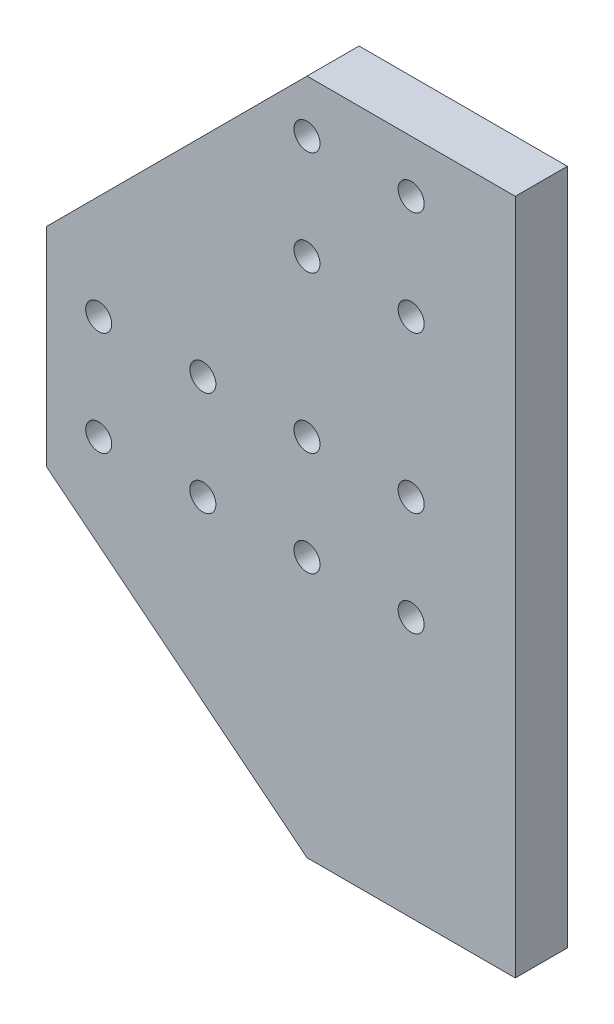
ISO-10303-21;
HEADER;
FILE_DESCRIPTION(('STEP AP214'),'2;1');
FILE_NAME('part.step','',(''),(''),'','','');
FILE_SCHEMA(('AUTOMOTIVE_DESIGN { 1 0 10303 214 1 1 1 1 }'));
ENDSEC;
DATA;
#1=APPLICATION_CONTEXT('core data for automotive mechanical design processes');
#2=APPLICATION_PROTOCOL_DEFINITION('international standard','automotive_design',2000,#1);
#3=PRODUCT_CONTEXT('',#1,'mechanical');
#4=PRODUCT('Part','Part','',(#3));
#5=PRODUCT_RELATED_PRODUCT_CATEGORY('part','',(#4));
#6=PRODUCT_DEFINITION_FORMATION('','',#4);
#7=PRODUCT_DEFINITION_CONTEXT('part definition',#1,'design');
#8=PRODUCT_DEFINITION('design','',#6,#7);
#9=PRODUCT_DEFINITION_SHAPE('','',#8);
#10=(LENGTH_UNIT() NAMED_UNIT(*) SI_UNIT(.MILLI.,.METRE.));
#11=(NAMED_UNIT(*) PLANE_ANGLE_UNIT() SI_UNIT($,.RADIAN.));
#12=(NAMED_UNIT(*) SI_UNIT($,.STERADIAN.) SOLID_ANGLE_UNIT());
#13=UNCERTAINTY_MEASURE_WITH_UNIT(LENGTH_MEASURE(1.E-05),#10,'distance_accuracy_value','');
#14=(GEOMETRIC_REPRESENTATION_CONTEXT(3) GLOBAL_UNCERTAINTY_ASSIGNED_CONTEXT((#13)) GLOBAL_UNIT_ASSIGNED_CONTEXT((#10,
#11,#12)) REPRESENTATION_CONTEXT('',''));
#15=CARTESIAN_POINT('',(0.,0.,0.));
#16=DIRECTION('',(0.,0.,1.));
#17=DIRECTION('',(1.,0.,0.));
#18=AXIS2_PLACEMENT_3D('',#15,#16,#17);
#19=CARTESIAN_POINT('',(-50.,40.,10.));
#20=DIRECTION('',(0.624695047554424,0.78086880944303,0.));
#21=DIRECTION('',(-0.78086880944303,0.624695047554424,0.));
#22=AXIS2_PLACEMENT_3D('',#19,#20,#21);
#23=PLANE('',#22);
#24=DIRECTION('',(0.78086880944303,-0.624695047554424,0.));
#25=VECTOR('',#24,1.);
#26=CARTESIAN_POINT('',(-50.,40.,0.));
#27=LINE('',#26,#25);
#28=CARTESIAN_POINT('',(-50.,40.,0.));
#29=VERTEX_POINT('',#28);
#30=CARTESIAN_POINT('',(0.,0.,0.));
#31=VERTEX_POINT('',#30);
#32=EDGE_CURVE('E123',#29,#31,#27,.T.);
#33=ORIENTED_EDGE('',*,*,#32,.T.);
#34=DIRECTION('',(0.,0.,-1.));
#35=VECTOR('',#34,1.);
#36=CARTESIAN_POINT('',(0.,0.,10.));
#37=LINE('',#36,#35);
#38=CARTESIAN_POINT('',(0.,0.,10.));
#39=VERTEX_POINT('',#38);
#40=EDGE_CURVE('E11',#39,#31,#37,.T.);
#41=ORIENTED_EDGE('',*,*,#40,.F.);
#42=DIRECTION('',(0.78086880944303,-0.624695047554424,0.));
#43=VECTOR('',#42,1.);
#44=CARTESIAN_POINT('',(-50.,40.,10.));
#45=LINE('',#44,#43);
#46=CARTESIAN_POINT('',(-50.,40.,10.));
#47=VERTEX_POINT('',#46);
#48=EDGE_CURVE('E134',#47,#39,#45,.T.);
#49=ORIENTED_EDGE('',*,*,#48,.F.);
#50=DIRECTION('',(0.,0.,-1.));
#51=VECTOR('',#50,1.);
#52=CARTESIAN_POINT('',(-50.,40.,10.));
#53=LINE('',#52,#51);
#54=EDGE_CURVE('E119',#47,#29,#53,.T.);
#55=ORIENTED_EDGE('',*,*,#54,.T.);
#56=EDGE_LOOP('',(#33,#41,#49,#55));
#57=FACE_BOUND('',#56,.T.);
#58=ADVANCED_FACE('F39',(#57),#23,.F.);
#59=CARTESIAN_POINT('',(0.,0.,10.));
#60=DIRECTION('',(0.,1.,0.));
#61=DIRECTION('',(0.,0.,1.));
#62=AXIS2_PLACEMENT_3D('',#59,#60,#61);
#63=PLANE('',#62);
#64=DIRECTION('',(1.,0.,0.));
#65=VECTOR('',#64,1.);
#66=CARTESIAN_POINT('',(0.,0.,0.));
#67=LINE('',#66,#65);
#68=CARTESIAN_POINT('',(40.,0.,0.));
#69=VERTEX_POINT('',#68);
#70=EDGE_CURVE('E126',#31,#69,#67,.T.);
#71=ORIENTED_EDGE('',*,*,#70,.T.);
#72=DIRECTION('',(0.,0.,-1.));
#73=VECTOR('',#72,1.);
#74=CARTESIAN_POINT('',(40.,0.,10.));
#75=LINE('',#74,#73);
#76=CARTESIAN_POINT('',(40.,0.,10.));
#77=VERTEX_POINT('',#76);
#78=EDGE_CURVE('E47',#77,#69,#75,.T.);
#79=ORIENTED_EDGE('',*,*,#78,.F.);
#80=DIRECTION('',(1.,0.,0.));
#81=VECTOR('',#80,1.);
#82=CARTESIAN_POINT('',(0.,0.,10.));
#83=LINE('',#82,#81);
#84=EDGE_CURVE('E92',#39,#77,#83,.T.);
#85=ORIENTED_EDGE('',*,*,#84,.F.);
#86=ORIENTED_EDGE('',*,*,#40,.T.);
#87=EDGE_LOOP('',(#71,#79,#85,#86));
#88=FACE_BOUND('',#87,.T.);
#89=ADVANCED_FACE('F159',(#88),#63,.F.);
#90=CARTESIAN_POINT('',(40.,0.,10.));
#91=DIRECTION('',(-1.,0.,0.));
#92=DIRECTION('',(0.,0.,1.));
#93=AXIS2_PLACEMENT_3D('',#90,#91,#92);
#94=PLANE('',#93);
#95=DIRECTION('',(0.,1.,0.));
#96=VECTOR('',#95,1.);
#97=CARTESIAN_POINT('',(40.,0.,0.));
#98=LINE('',#97,#96);
#99=CARTESIAN_POINT('',(40.,130.,0.));
#100=VERTEX_POINT('',#99);
#101=EDGE_CURVE('E129',#69,#100,#98,.T.);
#102=ORIENTED_EDGE('',*,*,#101,.T.);
#103=DIRECTION('',(0.,0.,-1.));
#104=VECTOR('',#103,1.);
#105=CARTESIAN_POINT('',(40.,130.,10.));
#106=LINE('',#105,#104);
#107=CARTESIAN_POINT('',(40.,130.,10.));
#108=VERTEX_POINT('',#107);
#109=EDGE_CURVE('E114',#108,#100,#106,.T.);
#110=ORIENTED_EDGE('',*,*,#109,.F.);
#111=DIRECTION('',(0.,1.,0.));
#112=VECTOR('',#111,1.);
#113=CARTESIAN_POINT('',(40.,0.,10.));
#114=LINE('',#113,#112);
#115=EDGE_CURVE('E105',#77,#108,#114,.T.);
#116=ORIENTED_EDGE('',*,*,#115,.F.);
#117=ORIENTED_EDGE('',*,*,#78,.T.);
#118=EDGE_LOOP('',(#102,#110,#116,#117));
#119=FACE_BOUND('',#118,.T.);
#120=ADVANCED_FACE('F140',(#119),#94,.F.);
#121=CARTESIAN_POINT('',(40.,130.,10.));
#122=DIRECTION('',(0.,-1.,0.));
#123=DIRECTION('',(0.,0.,-1.));
#124=AXIS2_PLACEMENT_3D('',#121,#122,#123);
#125=PLANE('',#124);
#126=DIRECTION('',(-1.,0.,0.));
#127=VECTOR('',#126,1.);
#128=CARTESIAN_POINT('',(40.,130.,0.));
#129=LINE('',#128,#127);
#130=CARTESIAN_POINT('',(0.,130.,0.));
#131=VERTEX_POINT('',#130);
#132=EDGE_CURVE('E113',#100,#131,#129,.T.);
#133=ORIENTED_EDGE('',*,*,#132,.T.);
#134=DIRECTION('',(0.,0.,-1.));
#135=VECTOR('',#134,1.);
#136=CARTESIAN_POINT('',(0.,130.,10.));
#137=LINE('',#136,#135);
#138=CARTESIAN_POINT('',(0.,130.,10.));
#139=VERTEX_POINT('',#138);
#140=EDGE_CURVE('E110',#139,#131,#137,.T.);
#141=ORIENTED_EDGE('',*,*,#140,.F.);
#142=DIRECTION('',(-1.,0.,0.));
#143=VECTOR('',#142,1.);
#144=CARTESIAN_POINT('',(40.,130.,10.));
#145=LINE('',#144,#143);
#146=EDGE_CURVE('E99',#108,#139,#145,.T.);
#147=ORIENTED_EDGE('',*,*,#146,.F.);
#148=ORIENTED_EDGE('',*,*,#109,.T.);
#149=EDGE_LOOP('',(#133,#141,#147,#148));
#150=FACE_BOUND('',#149,.T.);
#151=ADVANCED_FACE('F111',(#150),#125,.F.);
#152=CARTESIAN_POINT('',(0.,130.,10.));
#153=DIRECTION('',(0.707106781186548,-0.707106781186547,0.));
#154=DIRECTION('',(0.707106781186547,0.707106781186548,0.));
#155=AXIS2_PLACEMENT_3D('',#152,#153,#154);
#156=PLANE('',#155);
#157=DIRECTION('',(-0.707106781186547,-0.707106781186548,0.));
#158=VECTOR('',#157,1.);
#159=CARTESIAN_POINT('',(0.,130.,0.));
#160=LINE('',#159,#158);
#161=CARTESIAN_POINT('',(-50.,80.,0.));
#162=VERTEX_POINT('',#161);
#163=EDGE_CURVE('E78',#131,#162,#160,.T.);
#164=ORIENTED_EDGE('',*,*,#163,.T.);
#165=DIRECTION('',(0.,0.,-1.));
#166=VECTOR('',#165,1.);
#167=CARTESIAN_POINT('',(-50.,80.,10.));
#168=LINE('',#167,#166);
#169=CARTESIAN_POINT('',(-50.,80.,10.));
#170=VERTEX_POINT('',#169);
#171=EDGE_CURVE('E115',#170,#162,#168,.T.);
#172=ORIENTED_EDGE('',*,*,#171,.F.);
#173=DIRECTION('',(-0.707106781186547,-0.707106781186548,0.));
#174=VECTOR('',#173,1.);
#175=CARTESIAN_POINT('',(0.,130.,10.));
#176=LINE('',#175,#174);
#177=EDGE_CURVE('E103',#139,#170,#176,.T.);
#178=ORIENTED_EDGE('',*,*,#177,.F.);
#179=ORIENTED_EDGE('',*,*,#140,.T.);
#180=EDGE_LOOP('',(#164,#172,#178,#179));
#181=FACE_BOUND('',#180,.T.);
#182=ADVANCED_FACE('F117',(#181),#156,.F.);
#183=CARTESIAN_POINT('',(-50.,80.,10.));
#184=DIRECTION('',(1.,0.,0.));
#185=DIRECTION('',(0.,1.,0.));
#186=AXIS2_PLACEMENT_3D('',#183,#184,#185);
#187=PLANE('',#186);
#188=DIRECTION('',(0.,-1.,0.));
#189=VECTOR('',#188,1.);
#190=CARTESIAN_POINT('',(-50.,80.,0.));
#191=LINE('',#190,#189);
#192=EDGE_CURVE('E84',#162,#29,#191,.T.);
#193=ORIENTED_EDGE('',*,*,#192,.T.);
#194=ORIENTED_EDGE('',*,*,#54,.F.);
#195=DIRECTION('',(0.,-1.,0.));
#196=VECTOR('',#195,1.);
#197=CARTESIAN_POINT('',(-50.,80.,10.));
#198=LINE('',#197,#196);
#199=EDGE_CURVE('E55',#170,#47,#198,.T.);
#200=ORIENTED_EDGE('',*,*,#199,.F.);
#201=ORIENTED_EDGE('',*,*,#171,.T.);
#202=EDGE_LOOP('',(#193,#194,#200,#201));
#203=FACE_BOUND('',#202,.T.);
#204=ADVANCED_FACE('F147',(#203),#187,.F.);
#205=CARTESIAN_POINT('',(0.,0.,10.));
#206=DIRECTION('',(0.,0.,-1.));
#207=DIRECTION('',(-1.,0.,0.));
#208=AXIS2_PLACEMENT_3D('',#205,#206,#207);
#209=PLANE('',#208);
#210=CARTESIAN_POINT('',(-20.,70.,10.));
#211=DIRECTION('',(0.,0.,1.));
#212=DIRECTION('',(1.,0.,0.));
#213=AXIS2_PLACEMENT_3D('',#210,#211,#212);
#214=CIRCLE('',#213,2.5);
#215=CARTESIAN_POINT('',(-17.5,70.,10.));
#216=VERTEX_POINT('',#215);
#217=EDGE_CURVE('E379',#216,#216,#214,.T.);
#218=ORIENTED_EDGE('',*,*,#217,.F.);
#219=EDGE_LOOP('',(#218));
#220=FACE_BOUND('',#219,.T.);
#221=CARTESIAN_POINT('',(-40.,50.,10.));
#222=DIRECTION('',(0.,0.,1.));
#223=DIRECTION('',(1.,0.,0.));
#224=AXIS2_PLACEMENT_3D('',#221,#222,#223);
#225=CIRCLE('',#224,2.5);
#226=CARTESIAN_POINT('',(-37.5,50.,10.));
#227=VERTEX_POINT('',#226);
#228=EDGE_CURVE('E385',#227,#227,#225,.T.);
#229=ORIENTED_EDGE('',*,*,#228,.F.);
#230=EDGE_LOOP('',(#229));
#231=FACE_BOUND('',#230,.T.);
#232=CARTESIAN_POINT('',(-20.,50.,10.));
#233=DIRECTION('',(0.,0.,1.));
#234=DIRECTION('',(1.,0.,0.));
#235=AXIS2_PLACEMENT_3D('',#232,#233,#234);
#236=CIRCLE('',#235,2.5);
#237=CARTESIAN_POINT('',(-17.5,50.,10.));
#238=VERTEX_POINT('',#237);
#239=EDGE_CURVE('E396',#238,#238,#236,.T.);
#240=ORIENTED_EDGE('',*,*,#239,.F.);
#241=EDGE_LOOP('',(#240));
#242=FACE_BOUND('',#241,.T.);
#243=CARTESIAN_POINT('',(0.,70.,10.));
#244=DIRECTION('',(0.,0.,1.));
#245=DIRECTION('',(1.,0.,0.));
#246=AXIS2_PLACEMENT_3D('',#243,#244,#245);
#247=CIRCLE('',#246,2.5);
#248=CARTESIAN_POINT('',(2.5,70.,10.));
#249=VERTEX_POINT('',#248);
#250=EDGE_CURVE('E454',#249,#249,#247,.T.);
#251=ORIENTED_EDGE('',*,*,#250,.F.);
#252=EDGE_LOOP('',(#251));
#253=FACE_BOUND('',#252,.T.);
#254=CARTESIAN_POINT('',(20.,120.,10.));
#255=DIRECTION('',(0.,0.,1.));
#256=DIRECTION('',(1.,0.,0.));
#257=AXIS2_PLACEMENT_3D('',#254,#255,#256);
#258=CIRCLE('',#257,2.5);
#259=CARTESIAN_POINT('',(22.5,120.,10.));
#260=VERTEX_POINT('',#259);
#261=EDGE_CURVE('E406',#260,#260,#258,.T.);
#262=ORIENTED_EDGE('',*,*,#261,.F.);
#263=EDGE_LOOP('',(#262));
#264=FACE_BOUND('',#263,.T.);
#265=CARTESIAN_POINT('',(0.,100.,10.));
#266=DIRECTION('',(0.,0.,1.));
#267=DIRECTION('',(1.,0.,0.));
#268=AXIS2_PLACEMENT_3D('',#265,#266,#267);
#269=CIRCLE('',#268,2.5);
#270=CARTESIAN_POINT('',(2.5,100.,10.));
#271=VERTEX_POINT('',#270);
#272=EDGE_CURVE('E413',#271,#271,#269,.T.);
#273=ORIENTED_EDGE('',*,*,#272,.F.);
#274=EDGE_LOOP('',(#273));
#275=FACE_BOUND('',#274,.T.);
#276=CARTESIAN_POINT('',(20.,100.,10.));
#277=DIRECTION('',(0.,0.,1.));
#278=DIRECTION('',(1.,0.,0.));
#279=AXIS2_PLACEMENT_3D('',#276,#277,#278);
#280=CIRCLE('',#279,2.5);
#281=CARTESIAN_POINT('',(22.5,100.,10.));
#282=VERTEX_POINT('',#281);
#283=EDGE_CURVE('E397',#282,#282,#280,.T.);
#284=ORIENTED_EDGE('',*,*,#283,.F.);
#285=EDGE_LOOP('',(#284));
#286=FACE_BOUND('',#285,.T.);
#287=CARTESIAN_POINT('',(-40.,70.,10.));
#288=DIRECTION('',(0.,0.,1.));
#289=DIRECTION('',(1.,0.,0.));
#290=AXIS2_PLACEMENT_3D('',#287,#288,#289);
#291=CIRCLE('',#290,2.5);
#292=CARTESIAN_POINT('',(-37.5,70.,10.));
#293=VERTEX_POINT('',#292);
#294=EDGE_CURVE('E383',#293,#293,#291,.T.);
#295=ORIENTED_EDGE('',*,*,#294,.F.);
#296=EDGE_LOOP('',(#295));
#297=FACE_BOUND('',#296,.T.);
#298=CARTESIAN_POINT('',(20.,50.,10.));
#299=DIRECTION('',(0.,0.,1.));
#300=DIRECTION('',(1.,0.,0.));
#301=AXIS2_PLACEMENT_3D('',#298,#299,#300);
#302=CIRCLE('',#301,2.5);
#303=CARTESIAN_POINT('',(22.5,50.,10.));
#304=VERTEX_POINT('',#303);
#305=EDGE_CURVE('E442',#304,#304,#302,.T.);
#306=ORIENTED_EDGE('',*,*,#305,.F.);
#307=EDGE_LOOP('',(#306));
#308=FACE_BOUND('',#307,.T.);
#309=CARTESIAN_POINT('',(0.,50.,10.));
#310=DIRECTION('',(0.,0.,1.));
#311=DIRECTION('',(1.,0.,0.));
#312=AXIS2_PLACEMENT_3D('',#309,#310,#311);
#313=CIRCLE('',#312,2.5);
#314=CARTESIAN_POINT('',(2.5,50.,10.));
#315=VERTEX_POINT('',#314);
#316=EDGE_CURVE('E446',#315,#315,#313,.T.);
#317=ORIENTED_EDGE('',*,*,#316,.F.);
#318=EDGE_LOOP('',(#317));
#319=FACE_BOUND('',#318,.T.);
#320=CARTESIAN_POINT('',(20.,70.,10.));
#321=DIRECTION('',(0.,0.,1.));
#322=DIRECTION('',(1.,0.,0.));
#323=AXIS2_PLACEMENT_3D('',#320,#321,#322);
#324=CIRCLE('',#323,2.5);
#325=CARTESIAN_POINT('',(22.5,70.,10.));
#326=VERTEX_POINT('',#325);
#327=EDGE_CURVE('E449',#326,#326,#324,.T.);
#328=ORIENTED_EDGE('',*,*,#327,.F.);
#329=EDGE_LOOP('',(#328));
#330=FACE_BOUND('',#329,.T.);
#331=CARTESIAN_POINT('',(0.,120.,10.));
#332=DIRECTION('',(0.,0.,1.));
#333=DIRECTION('',(1.,0.,0.));
#334=AXIS2_PLACEMENT_3D('',#331,#332,#333);
#335=CIRCLE('',#334,2.5);
#336=CARTESIAN_POINT('',(2.5,120.,10.));
#337=VERTEX_POINT('',#336);
#338=EDGE_CURVE('E409',#337,#337,#335,.T.);
#339=ORIENTED_EDGE('',*,*,#338,.F.);
#340=EDGE_LOOP('',(#339));
#341=FACE_BOUND('',#340,.T.);
#342=ORIENTED_EDGE('',*,*,#48,.T.);
#343=ORIENTED_EDGE('',*,*,#84,.T.);
#344=ORIENTED_EDGE('',*,*,#115,.T.);
#345=ORIENTED_EDGE('',*,*,#146,.T.);
#346=ORIENTED_EDGE('',*,*,#177,.T.);
#347=ORIENTED_EDGE('',*,*,#199,.T.);
#348=EDGE_LOOP('',(#342,#343,#344,#345,#346,#347));
#349=FACE_BOUND('',#348,.T.);
#350=ADVANCED_FACE('F101',(#220,#231,#242,#253,#264,#275,#286,#297,#308,#319,#330,#341,#349),
#209,.F.);
#351=CARTESIAN_POINT('',(0.,0.,0.));
#352=DIRECTION('',(0.,0.,-1.));
#353=DIRECTION('',(-1.,0.,0.));
#354=AXIS2_PLACEMENT_3D('',#351,#352,#353);
#355=PLANE('',#354);
#356=CARTESIAN_POINT('',(-20.,70.,0.));
#357=DIRECTION('',(0.,0.,1.));
#358=DIRECTION('',(1.,0.,0.));
#359=AXIS2_PLACEMENT_3D('',#356,#357,#358);
#360=CIRCLE('',#359,2.5);
#361=CARTESIAN_POINT('',(-17.5,70.,0.));
#362=VERTEX_POINT('',#361);
#363=EDGE_CURVE('E376',#362,#362,#360,.T.);
#364=ORIENTED_EDGE('',*,*,#363,.T.);
#365=EDGE_LOOP('',(#364));
#366=FACE_BOUND('',#365,.T.);
#367=CARTESIAN_POINT('',(-40.,50.,0.));
#368=DIRECTION('',(0.,0.,1.));
#369=DIRECTION('',(1.,0.,0.));
#370=AXIS2_PLACEMENT_3D('',#367,#368,#369);
#371=CIRCLE('',#370,2.5);
#372=CARTESIAN_POINT('',(-37.5,50.,0.));
#373=VERTEX_POINT('',#372);
#374=EDGE_CURVE('E393',#373,#373,#371,.T.);
#375=ORIENTED_EDGE('',*,*,#374,.T.);
#376=EDGE_LOOP('',(#375));
#377=FACE_BOUND('',#376,.T.);
#378=CARTESIAN_POINT('',(-20.,50.,0.));
#379=DIRECTION('',(0.,0.,1.));
#380=DIRECTION('',(1.,0.,0.));
#381=AXIS2_PLACEMENT_3D('',#378,#379,#380);
#382=CIRCLE('',#381,2.5);
#383=CARTESIAN_POINT('',(-17.5,50.,0.));
#384=VERTEX_POINT('',#383);
#385=EDGE_CURVE('E467',#384,#384,#382,.T.);
#386=ORIENTED_EDGE('',*,*,#385,.T.);
#387=EDGE_LOOP('',(#386));
#388=FACE_BOUND('',#387,.T.);
#389=CARTESIAN_POINT('',(0.,70.,0.));
#390=DIRECTION('',(0.,0.,1.));
#391=DIRECTION('',(1.,0.,0.));
#392=AXIS2_PLACEMENT_3D('',#389,#390,#391);
#393=CIRCLE('',#392,2.5);
#394=CARTESIAN_POINT('',(2.5,70.,0.));
#395=VERTEX_POINT('',#394);
#396=EDGE_CURVE('E388',#395,#395,#393,.T.);
#397=ORIENTED_EDGE('',*,*,#396,.T.);
#398=EDGE_LOOP('',(#397));
#399=FACE_BOUND('',#398,.T.);
#400=CARTESIAN_POINT('',(20.,120.,0.));
#401=DIRECTION('',(0.,0.,1.));
#402=DIRECTION('',(1.,0.,0.));
#403=AXIS2_PLACEMENT_3D('',#400,#401,#402);
#404=CIRCLE('',#403,2.5);
#405=CARTESIAN_POINT('',(22.5,120.,0.));
#406=VERTEX_POINT('',#405);
#407=EDGE_CURVE('E410',#406,#406,#404,.T.);
#408=ORIENTED_EDGE('',*,*,#407,.T.);
#409=EDGE_LOOP('',(#408));
#410=FACE_BOUND('',#409,.T.);
#411=CARTESIAN_POINT('',(0.,100.,0.));
#412=DIRECTION('',(0.,0.,1.));
#413=DIRECTION('',(1.,0.,0.));
#414=AXIS2_PLACEMENT_3D('',#411,#412,#413);
#415=CIRCLE('',#414,2.5);
#416=CARTESIAN_POINT('',(2.5,100.,0.));
#417=VERTEX_POINT('',#416);
#418=EDGE_CURVE('E400',#417,#417,#415,.T.);
#419=ORIENTED_EDGE('',*,*,#418,.T.);
#420=EDGE_LOOP('',(#419));
#421=FACE_BOUND('',#420,.T.);
#422=CARTESIAN_POINT('',(20.,100.,0.));
#423=DIRECTION('',(0.,0.,1.));
#424=DIRECTION('',(1.,0.,0.));
#425=AXIS2_PLACEMENT_3D('',#422,#423,#424);
#426=CIRCLE('',#425,2.5);
#427=CARTESIAN_POINT('',(22.5,100.,0.));
#428=VERTEX_POINT('',#427);
#429=EDGE_CURVE('E401',#428,#428,#426,.T.);
#430=ORIENTED_EDGE('',*,*,#429,.T.);
#431=EDGE_LOOP('',(#430));
#432=FACE_BOUND('',#431,.T.);
#433=CARTESIAN_POINT('',(-40.,70.,0.));
#434=DIRECTION('',(0.,0.,1.));
#435=DIRECTION('',(1.,0.,0.));
#436=AXIS2_PLACEMENT_3D('',#433,#434,#435);
#437=CIRCLE('',#436,2.5);
#438=CARTESIAN_POINT('',(-37.5,70.,0.));
#439=VERTEX_POINT('',#438);
#440=EDGE_CURVE('E380',#439,#439,#437,.T.);
#441=ORIENTED_EDGE('',*,*,#440,.T.);
#442=EDGE_LOOP('',(#441));
#443=FACE_BOUND('',#442,.T.);
#444=CARTESIAN_POINT('',(20.,50.,0.));
#445=DIRECTION('',(0.,0.,1.));
#446=DIRECTION('',(1.,0.,0.));
#447=AXIS2_PLACEMENT_3D('',#444,#445,#446);
#448=CIRCLE('',#447,2.5);
#449=CARTESIAN_POINT('',(22.5,50.,0.));
#450=VERTEX_POINT('',#449);
#451=EDGE_CURVE('E458',#450,#450,#448,.T.);
#452=ORIENTED_EDGE('',*,*,#451,.T.);
#453=EDGE_LOOP('',(#452));
#454=FACE_BOUND('',#453,.T.);
#455=CARTESIAN_POINT('',(0.,50.,0.));
#456=DIRECTION('',(0.,0.,1.));
#457=DIRECTION('',(1.,0.,0.));
#458=AXIS2_PLACEMENT_3D('',#455,#456,#457);
#459=CIRCLE('',#458,2.5);
#460=CARTESIAN_POINT('',(2.5,50.,0.));
#461=VERTEX_POINT('',#460);
#462=EDGE_CURVE('E462',#461,#461,#459,.T.);
#463=ORIENTED_EDGE('',*,*,#462,.T.);
#464=EDGE_LOOP('',(#463));
#465=FACE_BOUND('',#464,.T.);
#466=CARTESIAN_POINT('',(20.,70.,0.));
#467=DIRECTION('',(0.,0.,1.));
#468=DIRECTION('',(1.,0.,0.));
#469=AXIS2_PLACEMENT_3D('',#466,#467,#468);
#470=CIRCLE('',#469,2.5);
#471=CARTESIAN_POINT('',(22.5,70.,0.));
#472=VERTEX_POINT('',#471);
#473=EDGE_CURVE('E451',#472,#472,#470,.T.);
#474=ORIENTED_EDGE('',*,*,#473,.T.);
#475=EDGE_LOOP('',(#474));
#476=FACE_BOUND('',#475,.T.);
#477=CARTESIAN_POINT('',(0.,120.,0.));
#478=DIRECTION('',(0.,0.,1.));
#479=DIRECTION('',(1.,0.,0.));
#480=AXIS2_PLACEMENT_3D('',#477,#478,#479);
#481=CIRCLE('',#480,2.5);
#482=CARTESIAN_POINT('',(2.5,120.,0.));
#483=VERTEX_POINT('',#482);
#484=EDGE_CURVE('E127',#483,#483,#481,.T.);
#485=ORIENTED_EDGE('',*,*,#484,.T.);
#486=EDGE_LOOP('',(#485));
#487=FACE_BOUND('',#486,.T.);
#488=ORIENTED_EDGE('',*,*,#32,.F.);
#489=ORIENTED_EDGE('',*,*,#192,.F.);
#490=ORIENTED_EDGE('',*,*,#163,.F.);
#491=ORIENTED_EDGE('',*,*,#132,.F.);
#492=ORIENTED_EDGE('',*,*,#101,.F.);
#493=ORIENTED_EDGE('',*,*,#70,.F.);
#494=EDGE_LOOP('',(#488,#489,#490,#491,#492,#493));
#495=FACE_BOUND('',#494,.T.);
#496=ADVANCED_FACE('F143',(#366,#377,#388,#399,#410,#421,#432,#443,#454,#465,#476,#487,#495),
#355,.T.);
#497=CARTESIAN_POINT('',(0.,120.,0.));
#498=DIRECTION('',(0.,0.,1.));
#499=DIRECTION('',(1.,0.,0.));
#500=AXIS2_PLACEMENT_3D('',#497,#498,#499);
#501=CYLINDRICAL_SURFACE('',#500,2.5);
#502=ORIENTED_EDGE('',*,*,#484,.F.);
#503=EDGE_LOOP('',(#502));
#504=FACE_BOUND('',#503,.T.);
#505=ORIENTED_EDGE('',*,*,#338,.T.);
#506=EDGE_LOOP('',(#505));
#507=FACE_BOUND('',#506,.T.);
#508=ADVANCED_FACE('F199',(#504,#507),#501,.F.);
#509=CARTESIAN_POINT('',(20.,70.,0.));
#510=DIRECTION('',(0.,0.,1.));
#511=DIRECTION('',(1.,0.,0.));
#512=AXIS2_PLACEMENT_3D('',#509,#510,#511);
#513=CYLINDRICAL_SURFACE('',#512,2.5);
#514=ORIENTED_EDGE('',*,*,#473,.F.);
#515=EDGE_LOOP('',(#514));
#516=FACE_BOUND('',#515,.T.);
#517=ORIENTED_EDGE('',*,*,#327,.T.);
#518=EDGE_LOOP('',(#517));
#519=FACE_BOUND('',#518,.T.);
#520=ADVANCED_FACE('F209',(#516,#519),#513,.F.);
#521=CARTESIAN_POINT('',(0.,50.,0.));
#522=DIRECTION('',(0.,0.,1.));
#523=DIRECTION('',(1.,0.,0.));
#524=AXIS2_PLACEMENT_3D('',#521,#522,#523);
#525=CYLINDRICAL_SURFACE('',#524,2.5);
#526=ORIENTED_EDGE('',*,*,#462,.F.);
#527=EDGE_LOOP('',(#526));
#528=FACE_BOUND('',#527,.T.);
#529=ORIENTED_EDGE('',*,*,#316,.T.);
#530=EDGE_LOOP('',(#529));
#531=FACE_BOUND('',#530,.T.);
#532=ADVANCED_FACE('F220',(#528,#531),#525,.F.);
#533=CARTESIAN_POINT('',(20.,50.,0.));
#534=DIRECTION('',(0.,0.,1.));
#535=DIRECTION('',(1.,0.,0.));
#536=AXIS2_PLACEMENT_3D('',#533,#534,#535);
#537=CYLINDRICAL_SURFACE('',#536,2.5);
#538=ORIENTED_EDGE('',*,*,#451,.F.);
#539=EDGE_LOOP('',(#538));
#540=FACE_BOUND('',#539,.T.);
#541=ORIENTED_EDGE('',*,*,#305,.T.);
#542=EDGE_LOOP('',(#541));
#543=FACE_BOUND('',#542,.T.);
#544=ADVANCED_FACE('F231',(#540,#543),#537,.F.);
#545=CARTESIAN_POINT('',(-40.,70.,0.));
#546=DIRECTION('',(0.,0.,1.));
#547=DIRECTION('',(1.,0.,0.));
#548=AXIS2_PLACEMENT_3D('',#545,#546,#547);
#549=CYLINDRICAL_SURFACE('',#548,2.5);
#550=ORIENTED_EDGE('',*,*,#440,.F.);
#551=EDGE_LOOP('',(#550));
#552=FACE_BOUND('',#551,.T.);
#553=ORIENTED_EDGE('',*,*,#294,.T.);
#554=EDGE_LOOP('',(#553));
#555=FACE_BOUND('',#554,.T.);
#556=ADVANCED_FACE('F242',(#552,#555),#549,.F.);
#557=CARTESIAN_POINT('',(20.,100.,0.));
#558=DIRECTION('',(0.,0.,1.));
#559=DIRECTION('',(1.,0.,0.));
#560=AXIS2_PLACEMENT_3D('',#557,#558,#559);
#561=CYLINDRICAL_SURFACE('',#560,2.5);
#562=ORIENTED_EDGE('',*,*,#429,.F.);
#563=EDGE_LOOP('',(#562));
#564=FACE_BOUND('',#563,.T.);
#565=ORIENTED_EDGE('',*,*,#283,.T.);
#566=EDGE_LOOP('',(#565));
#567=FACE_BOUND('',#566,.T.);
#568=ADVANCED_FACE('F253',(#564,#567),#561,.F.);
#569=CARTESIAN_POINT('',(0.,100.,0.));
#570=DIRECTION('',(0.,0.,1.));
#571=DIRECTION('',(1.,0.,0.));
#572=AXIS2_PLACEMENT_3D('',#569,#570,#571);
#573=CYLINDRICAL_SURFACE('',#572,2.5);
#574=ORIENTED_EDGE('',*,*,#418,.F.);
#575=EDGE_LOOP('',(#574));
#576=FACE_BOUND('',#575,.T.);
#577=ORIENTED_EDGE('',*,*,#272,.T.);
#578=EDGE_LOOP('',(#577));
#579=FACE_BOUND('',#578,.T.);
#580=ADVANCED_FACE('F264',(#576,#579),#573,.F.);
#581=CARTESIAN_POINT('',(20.,120.,0.));
#582=DIRECTION('',(0.,0.,1.));
#583=DIRECTION('',(1.,0.,0.));
#584=AXIS2_PLACEMENT_3D('',#581,#582,#583);
#585=CYLINDRICAL_SURFACE('',#584,2.5);
#586=ORIENTED_EDGE('',*,*,#407,.F.);
#587=EDGE_LOOP('',(#586));
#588=FACE_BOUND('',#587,.T.);
#589=ORIENTED_EDGE('',*,*,#261,.T.);
#590=EDGE_LOOP('',(#589));
#591=FACE_BOUND('',#590,.T.);
#592=ADVANCED_FACE('F275',(#588,#591),#585,.F.);
#593=CARTESIAN_POINT('',(0.,70.,0.));
#594=DIRECTION('',(0.,0.,1.));
#595=DIRECTION('',(1.,0.,0.));
#596=AXIS2_PLACEMENT_3D('',#593,#594,#595);
#597=CYLINDRICAL_SURFACE('',#596,2.5);
#598=ORIENTED_EDGE('',*,*,#396,.F.);
#599=EDGE_LOOP('',(#598));
#600=FACE_BOUND('',#599,.T.);
#601=ORIENTED_EDGE('',*,*,#250,.T.);
#602=EDGE_LOOP('',(#601));
#603=FACE_BOUND('',#602,.T.);
#604=ADVANCED_FACE('F286',(#600,#603),#597,.F.);
#605=CARTESIAN_POINT('',(-20.,50.,0.));
#606=DIRECTION('',(0.,0.,1.));
#607=DIRECTION('',(1.,0.,0.));
#608=AXIS2_PLACEMENT_3D('',#605,#606,#607);
#609=CYLINDRICAL_SURFACE('',#608,2.5);
#610=ORIENTED_EDGE('',*,*,#385,.F.);
#611=EDGE_LOOP('',(#610));
#612=FACE_BOUND('',#611,.T.);
#613=ORIENTED_EDGE('',*,*,#239,.T.);
#614=EDGE_LOOP('',(#613));
#615=FACE_BOUND('',#614,.T.);
#616=ADVANCED_FACE('F297',(#612,#615),#609,.F.);
#617=CARTESIAN_POINT('',(-40.,50.,0.));
#618=DIRECTION('',(0.,0.,1.));
#619=DIRECTION('',(1.,0.,0.));
#620=AXIS2_PLACEMENT_3D('',#617,#618,#619);
#621=CYLINDRICAL_SURFACE('',#620,2.5);
#622=ORIENTED_EDGE('',*,*,#374,.F.);
#623=EDGE_LOOP('',(#622));
#624=FACE_BOUND('',#623,.T.);
#625=ORIENTED_EDGE('',*,*,#228,.T.);
#626=EDGE_LOOP('',(#625));
#627=FACE_BOUND('',#626,.T.);
#628=ADVANCED_FACE('F308',(#624,#627),#621,.F.);
#629=CARTESIAN_POINT('',(-20.,70.,0.));
#630=DIRECTION('',(0.,0.,1.));
#631=DIRECTION('',(1.,0.,0.));
#632=AXIS2_PLACEMENT_3D('',#629,#630,#631);
#633=CYLINDRICAL_SURFACE('',#632,2.5);
#634=ORIENTED_EDGE('',*,*,#363,.F.);
#635=EDGE_LOOP('',(#634));
#636=FACE_BOUND('',#635,.T.);
#637=ORIENTED_EDGE('',*,*,#217,.T.);
#638=EDGE_LOOP('',(#637));
#639=FACE_BOUND('',#638,.T.);
#640=ADVANCED_FACE('F319',(#636,#639),#633,.F.);
#641=CLOSED_SHELL('',(#58,#89,#120,#151,#182,#204,#350,#496,#508,#520,#532,#544,#556,#568,#580,
#592,#604,#616,#628,#640));
#642=MANIFOLD_SOLID_BREP('B2',#641);
#643=ADVANCED_BREP_SHAPE_REPRESENTATION('',(#18,#642),#14);
#644=SHAPE_DEFINITION_REPRESENTATION(#9,#643);
ENDSEC;
END-ISO-10303-21;
